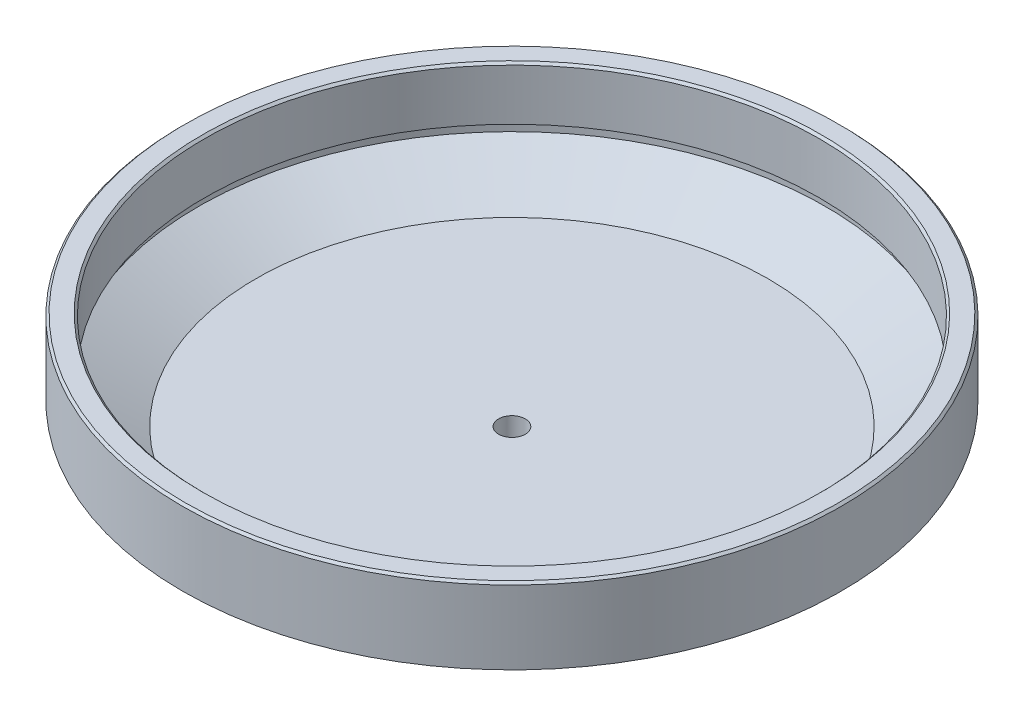
ISO-10303-21;
HEADER;
FILE_DESCRIPTION(('STEP AP214'),'2;1');
FILE_NAME('part.step','',(''),(''),'','','');
FILE_SCHEMA(('AUTOMOTIVE_DESIGN { 1 0 10303 214 1 1 1 1 }'));
ENDSEC;
DATA;
#1=APPLICATION_CONTEXT('core data for automotive mechanical design processes');
#2=APPLICATION_PROTOCOL_DEFINITION('international standard','automotive_design',2000,#1);
#3=PRODUCT_CONTEXT('',#1,'mechanical');
#4=PRODUCT('Part','Part','',(#3));
#5=PRODUCT_RELATED_PRODUCT_CATEGORY('part','',(#4));
#6=PRODUCT_DEFINITION_FORMATION('','',#4);
#7=PRODUCT_DEFINITION_CONTEXT('part definition',#1,'design');
#8=PRODUCT_DEFINITION('design','',#6,#7);
#9=PRODUCT_DEFINITION_SHAPE('','',#8);
#10=(LENGTH_UNIT() NAMED_UNIT(*) SI_UNIT(.MILLI.,.METRE.));
#11=(NAMED_UNIT(*) PLANE_ANGLE_UNIT() SI_UNIT($,.RADIAN.));
#12=(NAMED_UNIT(*) SI_UNIT($,.STERADIAN.) SOLID_ANGLE_UNIT());
#13=UNCERTAINTY_MEASURE_WITH_UNIT(LENGTH_MEASURE(1.E-05),#10,'distance_accuracy_value','');
#14=(GEOMETRIC_REPRESENTATION_CONTEXT(3) GLOBAL_UNCERTAINTY_ASSIGNED_CONTEXT((#13)) GLOBAL_UNIT_ASSIGNED_CONTEXT((#10,
#11,#12)) REPRESENTATION_CONTEXT('',''));
#15=CARTESIAN_POINT('',(0.,0.,0.));
#16=DIRECTION('',(0.,0.,1.));
#17=DIRECTION('',(1.,0.,0.));
#18=AXIS2_PLACEMENT_3D('',#15,#16,#17);
#19=CARTESIAN_POINT('',(69.,28.,-4.81824424760352E-13));
#20=DIRECTION('',(0.,1.,0.));
#21=DIRECTION('',(0.,0.,1.));
#22=AXIS2_PLACEMENT_3D('',#19,#20,#21);
#23=PLANE('',#22);
#24=CARTESIAN_POINT('',(0.,28.,0.));
#25=DIRECTION('',(0.,1.,0.));
#26=DIRECTION('',(0.,0.,1.));
#27=AXIS2_PLACEMENT_3D('',#24,#25,#26);
#28=CIRCLE('',#27,73.5);
#29=CARTESIAN_POINT('',(0.,28.,73.5));
#30=VERTEX_POINT('',#29);
#31=EDGE_CURVE('E46',#30,#30,#28,.T.);
#32=ORIENTED_EDGE('',*,*,#31,.T.);
#33=EDGE_LOOP('',(#32));
#34=FACE_BOUND('',#33,.T.);
#35=CARTESIAN_POINT('',(0.,28.,0.));
#36=DIRECTION('',(0.,1.,0.));
#37=DIRECTION('',(0.,0.,1.));
#38=AXIS2_PLACEMENT_3D('',#35,#36,#37);
#39=CIRCLE('',#38,69.5);
#40=CARTESIAN_POINT('',(0.,28.,69.5));
#41=VERTEX_POINT('',#40);
#42=EDGE_CURVE('E50',#41,#41,#39,.F.);
#43=ORIENTED_EDGE('',*,*,#42,.T.);
#44=EDGE_LOOP('',(#43));
#45=FACE_BOUND('',#44,.T.);
#46=ADVANCED_FACE('F35',(#34,#45),#23,.T.);
#47=CARTESIAN_POINT('',(0.,26.1689859870494,0.));
#48=DIRECTION('',(0.,1.,0.));
#49=DIRECTION('',(0.,0.,1.));
#50=AXIS2_PLACEMENT_3D('',#47,#48,#49);
#51=CYLINDRICAL_SURFACE('',#50,74.);
#52=CARTESIAN_POINT('',(0.,27.5,0.));
#53=DIRECTION('',(0.,1.,0.));
#54=DIRECTION('',(0.,0.,1.));
#55=AXIS2_PLACEMENT_3D('',#52,#53,#54);
#56=CIRCLE('',#55,74.);
#57=CARTESIAN_POINT('',(0.,27.5,74.));
#58=VERTEX_POINT('',#57);
#59=EDGE_CURVE('E42',#58,#58,#56,.F.);
#60=ORIENTED_EDGE('',*,*,#59,.T.);
#61=EDGE_LOOP('',(#60));
#62=FACE_BOUND('',#61,.T.);
#63=CARTESIAN_POINT('',(0.,11.,0.));
#64=DIRECTION('',(0.,1.,0.));
#65=DIRECTION('',(0.,0.,1.));
#66=AXIS2_PLACEMENT_3D('',#63,#64,#65);
#67=CIRCLE('',#66,74.);
#68=CARTESIAN_POINT('',(0.,11.,74.));
#69=VERTEX_POINT('',#68);
#70=EDGE_CURVE('E61',#69,#69,#67,.T.);
#71=ORIENTED_EDGE('',*,*,#70,.T.);
#72=EDGE_LOOP('',(#71));
#73=FACE_BOUND('',#72,.T.);
#74=ADVANCED_FACE('F100',(#62,#73),#51,.T.);
#75=CARTESIAN_POINT('',(0.,11.,0.));
#76=DIRECTION('',(0.,1.,0.));
#77=DIRECTION('',(0.,0.,1.));
#78=AXIS2_PLACEMENT_3D('',#75,#76,#77);
#79=CONICAL_SURFACE('',#78,74.,1.0471975511966);
#80=CARTESIAN_POINT('',(0.,0.,0.));
#81=DIRECTION('',(0.,1.,0.));
#82=DIRECTION('',(0.,0.,1.));
#83=AXIS2_PLACEMENT_3D('',#80,#81,#82);
#84=CIRCLE('',#83,54.9474411167422);
#85=CARTESIAN_POINT('',(0.,0.,54.9474411167422));
#86=VERTEX_POINT('',#85);
#87=EDGE_CURVE('E64',#86,#86,#84,.T.);
#88=ORIENTED_EDGE('',*,*,#87,.T.);
#89=EDGE_LOOP('',(#88));
#90=FACE_BOUND('',#89,.T.);
#91=ORIENTED_EDGE('',*,*,#70,.F.);
#92=EDGE_LOOP('',(#91));
#93=FACE_BOUND('',#92,.T.);
#94=ADVANCED_FACE('F106',(#90,#93),#79,.T.);
#95=CARTESIAN_POINT('',(54.9474411167422,0.,-3.83695930552575E-13));
#96=DIRECTION('',(0.,-1.,0.));
#97=DIRECTION('',(0.,0.,-1.));
#98=AXIS2_PLACEMENT_3D('',#95,#96,#97);
#99=PLANE('',#98);
#100=CARTESIAN_POINT('',(0.,0.,0.));
#101=DIRECTION('',(0.,-1.,0.));
#102=DIRECTION('',(0.,0.,-1.));
#103=AXIS2_PLACEMENT_3D('',#100,#101,#102);
#104=CIRCLE('',#103,3.49999999999998);
#105=CARTESIAN_POINT('',(0.,0.,-3.49999999999998));
#106=VERTEX_POINT('',#105);
#107=EDGE_CURVE('E58',#106,#106,#104,.F.);
#108=ORIENTED_EDGE('',*,*,#107,.T.);
#109=EDGE_LOOP('',(#108));
#110=FACE_BOUND('',#109,.T.);
#111=ORIENTED_EDGE('',*,*,#87,.F.);
#112=EDGE_LOOP('',(#111));
#113=FACE_BOUND('',#112,.T.);
#114=ADVANCED_FACE('F147',(#110,#113),#99,.T.);
#115=CARTESIAN_POINT('',(0.,26.1689859870494,0.));
#116=DIRECTION('',(0.,1.,0.));
#117=DIRECTION('',(0.,0.,1.));
#118=AXIS2_PLACEMENT_3D('',#115,#116,#117);
#119=CYLINDRICAL_SURFACE('',#118,3.);
#120=CARTESIAN_POINT('',(0.,0.499999999999997,0.));
#121=DIRECTION('',(0.,-1.,0.));
#122=DIRECTION('',(0.,0.,-1.));
#123=AXIS2_PLACEMENT_3D('',#120,#121,#122);
#124=CIRCLE('',#123,3.);
#125=CARTESIAN_POINT('',(0.,0.499999999999997,-3.));
#126=VERTEX_POINT('',#125);
#127=EDGE_CURVE('E55',#126,#126,#124,.T.);
#128=ORIENTED_EDGE('',*,*,#127,.T.);
#129=EDGE_LOOP('',(#128));
#130=FACE_BOUND('',#129,.T.);
#131=CARTESIAN_POINT('',(0.,6.,0.));
#132=DIRECTION('',(0.,1.,0.));
#133=DIRECTION('',(0.,0.,1.));
#134=AXIS2_PLACEMENT_3D('',#131,#132,#133);
#135=CIRCLE('',#134,3.);
#136=CARTESIAN_POINT('',(0.,6.,3.));
#137=VERTEX_POINT('',#136);
#138=EDGE_CURVE('E67',#137,#137,#135,.T.);
#139=ORIENTED_EDGE('',*,*,#138,.T.);
#140=EDGE_LOOP('',(#139));
#141=FACE_BOUND('',#140,.T.);
#142=ADVANCED_FACE('F142',(#130,#141),#119,.F.);
#143=CARTESIAN_POINT('',(3.,6.,0.));
#144=DIRECTION('',(0.,1.,0.));
#145=DIRECTION('',(0.,0.,1.));
#146=AXIS2_PLACEMENT_3D('',#143,#144,#145);
#147=PLANE('',#146);
#148=CARTESIAN_POINT('',(0.,5.99999999999999,0.));
#149=DIRECTION('',(0.,1.,0.));
#150=DIRECTION('',(0.,0.,1.));
#151=AXIS2_PLACEMENT_3D('',#148,#149,#150);
#152=CIRCLE('',#151,57.5096189432333);
#153=CARTESIAN_POINT('',(0.,5.99999999999999,57.5096189432333));
#154=VERTEX_POINT('',#153);
#155=EDGE_CURVE('E70',#154,#154,#152,.T.);
#156=ORIENTED_EDGE('',*,*,#155,.T.);
#157=EDGE_LOOP('',(#156));
#158=FACE_BOUND('',#157,.T.);
#159=ORIENTED_EDGE('',*,*,#138,.F.);
#160=EDGE_LOOP('',(#159));
#161=FACE_BOUND('',#160,.T.);
#162=ADVANCED_FACE('F146',(#158,#161),#147,.T.);
#163=CARTESIAN_POINT('',(0.,5.99999999999999,0.));
#164=DIRECTION('',(0.,1.,0.));
#165=DIRECTION('',(0.,0.,1.));
#166=AXIS2_PLACEMENT_3D('',#163,#164,#165);
#167=CONICAL_SURFACE('',#166,57.5096189432333,1.0471975511966);
#168=CARTESIAN_POINT('',(0.,13.5,0.));
#169=DIRECTION('',(0.,1.,0.));
#170=DIRECTION('',(0.,0.,1.));
#171=AXIS2_PLACEMENT_3D('',#168,#169,#170);
#172=CIRCLE('',#171,70.5);
#173=CARTESIAN_POINT('',(0.,13.5,70.5));
#174=VERTEX_POINT('',#173);
#175=EDGE_CURVE('E73',#174,#174,#172,.T.);
#176=ORIENTED_EDGE('',*,*,#175,.T.);
#177=EDGE_LOOP('',(#176));
#178=FACE_BOUND('',#177,.T.);
#179=ORIENTED_EDGE('',*,*,#155,.F.);
#180=EDGE_LOOP('',(#179));
#181=FACE_BOUND('',#180,.T.);
#182=ADVANCED_FACE('F185',(#178,#181),#167,.F.);
#183=CARTESIAN_POINT('',(0.,26.1689859870494,0.));
#184=DIRECTION('',(0.,1.,0.));
#185=DIRECTION('',(0.,0.,1.));
#186=AXIS2_PLACEMENT_3D('',#183,#184,#185);
#187=CYLINDRICAL_SURFACE('',#186,70.5);
#188=CARTESIAN_POINT('',(0.,16.,0.));
#189=DIRECTION('',(0.,1.,0.));
#190=DIRECTION('',(0.,0.,1.));
#191=AXIS2_PLACEMENT_3D('',#188,#189,#190);
#192=CIRCLE('',#191,70.5);
#193=CARTESIAN_POINT('',(0.,16.,70.5));
#194=VERTEX_POINT('',#193);
#195=EDGE_CURVE('E76',#194,#194,#192,.T.);
#196=ORIENTED_EDGE('',*,*,#195,.T.);
#197=EDGE_LOOP('',(#196));
#198=FACE_BOUND('',#197,.T.);
#199=ORIENTED_EDGE('',*,*,#175,.F.);
#200=EDGE_LOOP('',(#199));
#201=FACE_BOUND('',#200,.T.);
#202=ADVANCED_FACE('F97',(#198,#201),#187,.F.);
#203=CARTESIAN_POINT('',(70.5,16.,-4.92298868776882E-13));
#204=DIRECTION('',(0.,-1.,0.));
#205=DIRECTION('',(0.,0.,-1.));
#206=AXIS2_PLACEMENT_3D('',#203,#204,#205);
#207=PLANE('',#206);
#208=CARTESIAN_POINT('',(0.,16.,0.));
#209=DIRECTION('',(0.,1.,0.));
#210=DIRECTION('',(0.,0.,1.));
#211=AXIS2_PLACEMENT_3D('',#208,#209,#210);
#212=CIRCLE('',#211,69.);
#213=CARTESIAN_POINT('',(0.,16.,69.));
#214=VERTEX_POINT('',#213);
#215=EDGE_CURVE('E79',#214,#214,#212,.T.);
#216=ORIENTED_EDGE('',*,*,#215,.T.);
#217=EDGE_LOOP('',(#216));
#218=FACE_BOUND('',#217,.T.);
#219=ORIENTED_EDGE('',*,*,#195,.F.);
#220=EDGE_LOOP('',(#219));
#221=FACE_BOUND('',#220,.T.);
#222=ADVANCED_FACE('F83',(#218,#221),#207,.T.);
#223=CARTESIAN_POINT('',(0.,26.1689859870494,0.));
#224=DIRECTION('',(0.,1.,0.));
#225=DIRECTION('',(0.,0.,1.));
#226=AXIS2_PLACEMENT_3D('',#223,#224,#225);
#227=CYLINDRICAL_SURFACE('',#226,69.);
#228=CARTESIAN_POINT('',(0.,27.5,0.));
#229=DIRECTION('',(0.,1.,0.));
#230=DIRECTION('',(0.,0.,1.));
#231=AXIS2_PLACEMENT_3D('',#228,#229,#230);
#232=CIRCLE('',#231,69.);
#233=CARTESIAN_POINT('',(0.,27.5,69.));
#234=VERTEX_POINT('',#233);
#235=EDGE_CURVE('E10',#234,#234,#232,.T.);
#236=ORIENTED_EDGE('',*,*,#235,.T.);
#237=EDGE_LOOP('',(#236));
#238=FACE_BOUND('',#237,.T.);
#239=ORIENTED_EDGE('',*,*,#215,.F.);
#240=EDGE_LOOP('',(#239));
#241=FACE_BOUND('',#240,.T.);
#242=ADVANCED_FACE('F86',(#238,#241),#227,.F.);
#243=CARTESIAN_POINT('',(0.,0.,0.));
#244=DIRECTION('',(0.,-1.,0.));
#245=DIRECTION('',(0.,0.,-1.));
#246=AXIS2_PLACEMENT_3D('',#243,#244,#245);
#247=CONICAL_SURFACE('',#246,3.49999999999998,0.78539816339743);
#248=ORIENTED_EDGE('',*,*,#127,.F.);
#249=EDGE_LOOP('',(#248));
#250=FACE_BOUND('',#249,.T.);
#251=ORIENTED_EDGE('',*,*,#107,.F.);
#252=EDGE_LOOP('',(#251));
#253=FACE_BOUND('',#252,.T.);
#254=ADVANCED_FACE('F88',(#250,#253),#247,.F.);
#255=CARTESIAN_POINT('',(0.,28.,0.));
#256=DIRECTION('',(0.,-1.,0.));
#257=DIRECTION('',(0.,0.,-1.));
#258=AXIS2_PLACEMENT_3D('',#255,#256,#257);
#259=CONICAL_SURFACE('',#258,73.5,0.785398163397462);
#260=ORIENTED_EDGE('',*,*,#59,.F.);
#261=EDGE_LOOP('',(#260));
#262=FACE_BOUND('',#261,.T.);
#263=ORIENTED_EDGE('',*,*,#31,.F.);
#264=EDGE_LOOP('',(#263));
#265=FACE_BOUND('',#264,.T.);
#266=ADVANCED_FACE('F94',(#262,#265),#259,.T.);
#267=CARTESIAN_POINT('',(0.,27.5,0.));
#268=DIRECTION('',(0.,1.,0.));
#269=DIRECTION('',(0.,0.,1.));
#270=AXIS2_PLACEMENT_3D('',#267,#268,#269);
#271=CONICAL_SURFACE('',#270,69.,0.785398163397435);
#272=ORIENTED_EDGE('',*,*,#42,.F.);
#273=EDGE_LOOP('',(#272));
#274=FACE_BOUND('',#273,.T.);
#275=ORIENTED_EDGE('',*,*,#235,.F.);
#276=EDGE_LOOP('',(#275));
#277=FACE_BOUND('',#276,.T.);
#278=ADVANCED_FACE('F37',(#274,#277),#271,.F.);
#279=CLOSED_SHELL('',(#46,#74,#94,#114,#142,#162,#182,#202,#222,#242,#254,#266,#278));
#280=MANIFOLD_SOLID_BREP('B2',#279);
#281=ADVANCED_BREP_SHAPE_REPRESENTATION('',(#18,#280),#14);
#282=SHAPE_DEFINITION_REPRESENTATION(#9,#281);
ENDSEC;
END-ISO-10303-21;
